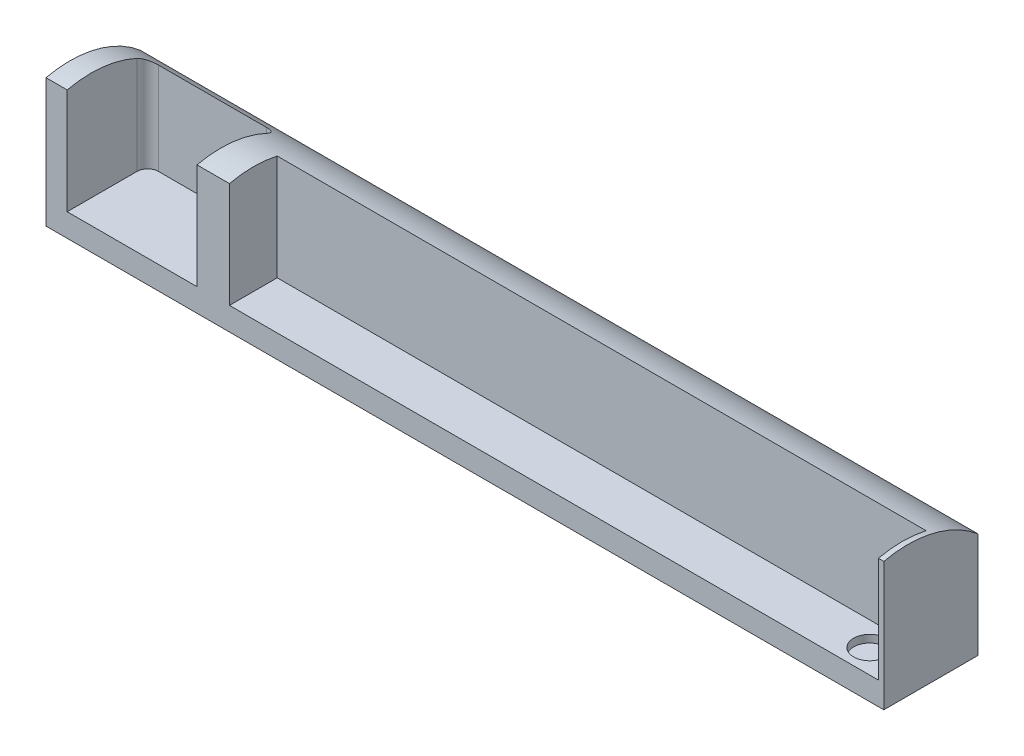
ISO-10303-21;
HEADER;
FILE_DESCRIPTION(('STEP AP214'),'2;1');
FILE_NAME('part.step','',(''),(''),'','','');
FILE_SCHEMA(('AUTOMOTIVE_DESIGN { 1 0 10303 214 1 1 1 1 }'));
ENDSEC;
DATA;
#1=APPLICATION_CONTEXT('core data for automotive mechanical design processes');
#2=APPLICATION_PROTOCOL_DEFINITION('international standard','automotive_design',2000,#1);
#3=PRODUCT_CONTEXT('',#1,'mechanical');
#4=PRODUCT('Part','Part','',(#3));
#5=PRODUCT_RELATED_PRODUCT_CATEGORY('part','',(#4));
#6=PRODUCT_DEFINITION_FORMATION('','',#4);
#7=PRODUCT_DEFINITION_CONTEXT('part definition',#1,'design');
#8=PRODUCT_DEFINITION('design','',#6,#7);
#9=PRODUCT_DEFINITION_SHAPE('','',#8);
#10=(LENGTH_UNIT() NAMED_UNIT(*) SI_UNIT(.MILLI.,.METRE.));
#11=(NAMED_UNIT(*) PLANE_ANGLE_UNIT() SI_UNIT($,.RADIAN.));
#12=(NAMED_UNIT(*) SI_UNIT($,.STERADIAN.) SOLID_ANGLE_UNIT());
#13=UNCERTAINTY_MEASURE_WITH_UNIT(LENGTH_MEASURE(1.E-05),#10,'distance_accuracy_value','');
#14=(GEOMETRIC_REPRESENTATION_CONTEXT(3) GLOBAL_UNCERTAINTY_ASSIGNED_CONTEXT((#13)) GLOBAL_UNIT_ASSIGNED_CONTEXT((#10,
#11,#12)) REPRESENTATION_CONTEXT('',''));
#15=CARTESIAN_POINT('',(0.,0.,0.));
#16=DIRECTION('',(0.,0.,1.));
#17=DIRECTION('',(1.,0.,0.));
#18=AXIS2_PLACEMENT_3D('',#15,#16,#17);
#19=CARTESIAN_POINT('',(125.384435556238,-100.,-65.));
#20=DIRECTION('',(-1.,0.,0.));
#21=DIRECTION('',(0.,0.,1.));
#22=AXIS2_PLACEMENT_3D('',#19,#20,#21);
#23=PLANE('',#22);
#24=DIRECTION('',(0.,1.,0.));
#25=VECTOR('',#24,1.);
#26=CARTESIAN_POINT('',(125.384435556238,-21.3342589780574,22.0794863015094));
#27=LINE('',#26,#25);
#28=CARTESIAN_POINT('',(125.384435556238,-21.3342589780574,22.0794863015094));
#29=VERTEX_POINT('',#28);
#30=CARTESIAN_POINT('',(125.384435556238,97.532026968896,22.0794863015094));
#31=VERTEX_POINT('',#30);
#32=EDGE_CURVE('E50',#29,#31,#27,.T.);
#33=ORIENTED_EDGE('',*,*,#32,.T.);
#34=CARTESIAN_POINT('',(125.384435556238,0.,0.));
#35=DIRECTION('',(-1.,0.,0.));
#36=DIRECTION('',(0.,0.,1.));
#37=AXIS2_PLACEMENT_3D('',#34,#35,#36);
#38=CIRCLE('',#37,100.);
#39=CARTESIAN_POINT('',(125.384435556238,75.9934207678533,-65.));
#40=VERTEX_POINT('',#39);
#41=EDGE_CURVE('E11',#31,#40,#38,.T.);
#42=ORIENTED_EDGE('',*,*,#41,.T.);
#43=DIRECTION('',(0.,1.,0.));
#44=VECTOR('',#43,1.);
#45=CARTESIAN_POINT('',(125.384435556238,-100.,-65.));
#46=LINE('',#45,#44);
#47=CARTESIAN_POINT('',(125.384435556238,-21.3342589780574,-65.));
#48=VERTEX_POINT('',#47);
#49=EDGE_CURVE('E158',#48,#40,#46,.T.);
#50=ORIENTED_EDGE('',*,*,#49,.F.);
#51=DIRECTION('',(0.,0.,1.));
#52=VECTOR('',#51,1.);
#53=CARTESIAN_POINT('',(125.384435556238,-21.3342589780574,-65.));
#54=LINE('',#53,#52);
#55=EDGE_CURVE('E156',#48,#29,#54,.T.);
#56=ORIENTED_EDGE('',*,*,#55,.T.);
#57=EDGE_LOOP('',(#33,#42,#50,#56));
#58=FACE_BOUND('',#57,.T.);
#59=ADVANCED_FACE('F34',(#58),#23,.T.);
#60=CARTESIAN_POINT('',(125.384435556238,-100.,-65.));
#61=DIRECTION('',(0.,0.,-1.));
#62=DIRECTION('',(-1.,0.,0.));
#63=AXIS2_PLACEMENT_3D('',#60,#61,#62);
#64=PLANE('',#63);
#65=DIRECTION('',(0.,1.,0.));
#66=VECTOR('',#65,1.);
#67=CARTESIAN_POINT('',(900.,-100.,-65.));
#68=LINE('',#67,#66);
#69=CARTESIAN_POINT('',(900.,-21.3342589780574,-65.));
#70=VERTEX_POINT('',#69);
#71=CARTESIAN_POINT('',(900.,75.9934207678534,-65.));
#72=VERTEX_POINT('',#71);
#73=EDGE_CURVE('E155',#70,#72,#68,.T.);
#74=ORIENTED_EDGE('',*,*,#73,.F.);
#75=DIRECTION('',(1.,0.,0.));
#76=VECTOR('',#75,1.);
#77=CARTESIAN_POINT('',(125.384435556238,-21.3342589780574,-65.));
#78=LINE('',#77,#76);
#79=EDGE_CURVE('E153',#48,#70,#78,.T.);
#80=ORIENTED_EDGE('',*,*,#79,.F.);
#81=ORIENTED_EDGE('',*,*,#49,.T.);
#82=DIRECTION('',(-1.,0.,0.));
#83=VECTOR('',#82,1.);
#84=CARTESIAN_POINT('',(0.,75.9934207678533,-65.));
#85=LINE('',#84,#83);
#86=EDGE_CURVE('E164',#40,#72,#85,.F.);
#87=ORIENTED_EDGE('',*,*,#86,.T.);
#88=EDGE_LOOP('',(#74,#80,#81,#87));
#89=FACE_BOUND('',#88,.T.);
#90=ADVANCED_FACE('F260',(#89),#64,.T.);
#91=CARTESIAN_POINT('',(900.,-100.,-65.));
#92=DIRECTION('',(1.,0.,0.));
#93=DIRECTION('',(0.,0.,-1.));
#94=AXIS2_PLACEMENT_3D('',#91,#92,#93);
#95=PLANE('',#94);
#96=DIRECTION('',(0.,1.,0.));
#97=VECTOR('',#96,1.);
#98=CARTESIAN_POINT('',(900.,-21.3342589780574,22.0794863015094));
#99=LINE('',#98,#97);
#100=CARTESIAN_POINT('',(900.,-21.3342589780574,22.0794863015094));
#101=VERTEX_POINT('',#100);
#102=CARTESIAN_POINT('',(900.,97.532026968896,22.0794863015094));
#103=VERTEX_POINT('',#102);
#104=EDGE_CURVE('E137',#101,#103,#99,.T.);
#105=ORIENTED_EDGE('',*,*,#104,.F.);
#106=DIRECTION('',(0.,0.,-1.));
#107=VECTOR('',#106,1.);
#108=CARTESIAN_POINT('',(900.,-21.3342589780574,-65.));
#109=LINE('',#108,#107);
#110=EDGE_CURVE('E147',#101,#70,#109,.T.);
#111=ORIENTED_EDGE('',*,*,#110,.T.);
#112=ORIENTED_EDGE('',*,*,#73,.T.);
#113=CARTESIAN_POINT('',(900.,0.,0.));
#114=DIRECTION('',(-1.,0.,0.));
#115=DIRECTION('',(0.,0.,1.));
#116=AXIS2_PLACEMENT_3D('',#113,#114,#115);
#117=CIRCLE('',#116,100.);
#118=EDGE_CURVE('E149',#103,#72,#117,.T.);
#119=ORIENTED_EDGE('',*,*,#118,.F.);
#120=EDGE_LOOP('',(#105,#111,#112,#119));
#121=FACE_BOUND('',#120,.T.);
#122=ADVANCED_FACE('F145',(#121),#95,.T.);
#123=CARTESIAN_POINT('',(0.,0.,0.));
#124=DIRECTION('',(-1.,0.,0.));
#125=DIRECTION('',(0.,0.,1.));
#126=AXIS2_PLACEMENT_3D('',#123,#124,#125);
#127=CYLINDRICAL_SURFACE('',#126,100.);
#128=ORIENTED_EDGE('',*,*,#41,.F.);
#129=DIRECTION('',(-1.,0.,0.));
#130=VECTOR('',#129,1.);
#131=CARTESIAN_POINT('',(0.,97.532026968896,22.0794863015094));
#132=LINE('',#131,#130);
#133=CARTESIAN_POINT('',(144.992275313291,97.532026968896,22.0794863015094));
#134=VERTEX_POINT('',#133);
#135=EDGE_CURVE('E321',#31,#134,#132,.F.);
#136=ORIENTED_EDGE('',*,*,#135,.T.);
#137=CARTESIAN_POINT('',(144.992275313291,0.,0.));
#138=DIRECTION('',(1.,0.,0.));
#139=DIRECTION('',(0.,0.,-1.));
#140=AXIS2_PLACEMENT_3D('',#137,#138,#139);
#141=CIRCLE('',#140,100.);
#142=CARTESIAN_POINT('',(144.992275313291,90.5790034168391,-42.3726815296394));
#143=VERTEX_POINT('',#142);
#144=EDGE_CURVE('E216',#143,#134,#141,.T.);
#145=ORIENTED_EDGE('',*,*,#144,.F.);
#146=CARTESIAN_POINT('',(144.992275313291,90.5790034168391,-42.3726815296394));
#147=CARTESIAN_POINT('',(144.992266455673,90.4327390532218,-42.6853887241199));
#148=CARTESIAN_POINT('',(145.006941937073,90.2848371835829,-42.9972956829604));
#149=CARTESIAN_POINT('',(145.065155574035,89.9869117356524,-43.6173482393163));
#150=CARTESIAN_POINT('',(145.108690953883,89.8368883627625,-43.9254941956582));
#151=CARTESIAN_POINT('',(145.224187646977,89.5356645003747,-44.5362900965118));
#152=CARTESIAN_POINT('',(145.296182917584,89.3844628169994,-44.8389330221261));
#153=CARTESIAN_POINT('',(145.468057545664,89.0822813849903,-45.436319477874));
#154=CARTESIAN_POINT('',(145.567937535926,88.9313016414712,-45.7310628285757));
#155=CARTESIAN_POINT('',(145.795038811292,88.6308562869436,-46.3106672280128));
#156=CARTESIAN_POINT('',(145.922262647325,88.4813908185663,-46.5955273518524));
#157=CARTESIAN_POINT('',(146.20352508244,88.185341391298,-47.1534232038708));
#158=CARTESIAN_POINT('',(146.357573009516,88.0387584545986,-47.426454777325));
#159=CARTESIAN_POINT('',(146.691794819526,87.750098730746,-47.9584375771485));
#160=CARTESIAN_POINT('',(146.871960823601,87.6080206003555,-48.2173930174908));
#161=CARTESIAN_POINT('',(147.257774886447,87.3299879200957,-48.719148982421));
#162=CARTESIAN_POINT('',(147.463423160135,87.194033421886,-48.9619493707319));
#163=CARTESIAN_POINT('',(147.893416699236,86.9336802151978,-49.4227008348896));
#164=CARTESIAN_POINT('',(148.117098414143,86.8090673792119,-49.6411492840996));
#165=CARTESIAN_POINT('',(148.586703051518,86.5692466260571,-50.0581999249176));
#166=CARTESIAN_POINT('',(148.832614451518,86.4540338947236,-50.256812287198));
#167=CARTESIAN_POINT('',(149.345462151893,86.2349095563728,-50.631882867991));
#168=CARTESIAN_POINT('',(149.612395645411,86.1309964450335,-50.8083440359831));
#169=CARTESIAN_POINT('',(150.165579457019,85.9365107152564,-51.1366066955166));
#170=CARTESIAN_POINT('',(150.451825356201,85.8459350600439,-51.288413801297));
#171=CARTESIAN_POINT('',(151.004998860787,85.6903878142627,-51.5478168037729));
#172=CARTESIAN_POINT('',(151.269954383665,85.6236361101927,-51.6585563345459));
#173=CARTESIAN_POINT('',(151.811034830617,85.5032627887518,-51.8575509786716));
#174=CARTESIAN_POINT('',(152.087157225089,85.4496382169235,-51.945811151521));
#175=CARTESIAN_POINT('',(152.647563022696,85.3567898078448,-52.0982379113052));
#176=CARTESIAN_POINT('',(152.931823843795,85.3175296328827,-52.1624653036134));
#177=CARTESIAN_POINT('',(153.50635729278,85.2541628258315,-52.2659682373049));
#178=CARTESIAN_POINT('',(153.796625089994,85.2300444714877,-52.3052630808252));
#179=CARTESIAN_POINT('',(154.238588367731,85.2054064705927,-52.3453812000194));
#180=CARTESIAN_POINT('',(154.389180251192,85.1991146450061,-52.3556201362944));
#181=CARTESIAN_POINT('',(154.690597701414,85.1907265806318,-52.3692671025232));
#182=CARTESIAN_POINT('',(154.841422728266,85.1886250219639,-52.3726837938726));
#183=CARTESIAN_POINT('',(154.992275313291,85.1886273477567,-52.3726815296394));
#184=B_SPLINE_CURVE_WITH_KNOTS('',3,(#146,#147,#148,#149,#150,#151,#152,#153,#154,#155,#156,
#157,#158,#159,#160,#161,#162,#163,#164,#165,#166,#167,#168,#169,#170,#171,#172,#173,#174,#175,
#176,#177,#178,#179,#180,#181,#182,#183),.UNSPECIFIED.,.F.,.F.,(4,2,2,2,2,2,2,2,2,2,2,2,2,2,2,2,
2,2,4),(0.,1.03530983791411,2.07052011533844,3.10696931642731,4.14344203962534,5.18001149818633,
6.2169421430761,7.25356063268882,8.29018786565977,9.29852019717618,10.3063328373354,
11.3140111423901,12.3214596555464,13.2046453057677,14.0876319987211,14.9683692923994,
15.8484239073268,16.3014494641075,16.7538995014114),.UNSPECIFIED.);
#185=CARTESIAN_POINT('',(154.992275313291,85.1886273477567,-52.3726815296394));
#186=VERTEX_POINT('',#185);
#187=EDGE_CURVE('E58',#143,#186,#184,.T.);
#188=ORIENTED_EDGE('',*,*,#187,.T.);
#189=DIRECTION('',(-1.,0.,0.));
#190=VECTOR('',#189,1.);
#191=CARTESIAN_POINT('',(0.,85.1886273477567,-52.3726815296394));
#192=LINE('',#191,#190);
#193=CARTESIAN_POINT('',(254.992275313291,85.1886273477567,-52.3726815296394));
#194=VERTEX_POINT('',#193);
#195=EDGE_CURVE('E212',#194,#186,#192,.T.);
#196=ORIENTED_EDGE('',*,*,#195,.F.);
#197=CARTESIAN_POINT('',(254.992275313291,85.1886273477567,-52.3726815296394));
#198=CARTESIAN_POINT('',(255.118945991111,85.1886263168288,-52.3726824767199));
#199=CARTESIAN_POINT('',(255.245599384915,85.1901074107686,-52.3702741710501));
#200=CARTESIAN_POINT('',(255.498651280743,85.1960201320163,-52.3606550761205));
#201=CARTESIAN_POINT('',(255.625049789664,85.2004516783693,-52.3534444186283));
#202=CARTESIAN_POINT('',(256.003376527491,85.2181437622612,-52.3246454199057));
#203=CARTESIAN_POINT('',(256.25460363012,85.2358017819059,-52.2958900074209));
#204=CARTESIAN_POINT('',(256.751836404865,85.2824027502174,-52.219859635304));
#205=CARTESIAN_POINT('',(256.997861872163,85.3112889650416,-52.1726777752802));
#206=CARTESIAN_POINT('',(257.484276800406,85.3798410827392,-52.0604173677622));
#207=CARTESIAN_POINT('',(257.724665896163,85.4195076820039,-51.9953376640997));
#208=CARTESIAN_POINT('',(258.197824873569,85.5088880193993,-51.8482155445565));
#209=CARTESIAN_POINT('',(258.430606286671,85.5585856457407,-51.766200325615));
#210=CARTESIAN_POINT('',(258.88768124347,85.6673238387794,-51.5860513247685));
#211=CARTESIAN_POINT('',(259.111971515159,85.7263679625823,-51.4879114055563));
#212=CARTESIAN_POINT('',(259.550957452831,85.8529949190893,-51.2764901793884));
#213=CARTESIAN_POINT('',(259.765647097481,85.9205830114844,-51.1631995430994));
#214=CARTESIAN_POINT('',(260.184409281917,86.0634323947222,-50.9225411103541));
#215=CARTESIAN_POINT('',(260.388477684314,86.1386966424362,-50.7951678876556));
#216=CARTESIAN_POINT('',(260.797821443829,86.3010474836128,-50.5188723053816));
#217=CARTESIAN_POINT('',(261.00234140876,86.3885821398158,-50.3690932040207));
#218=CARTESIAN_POINT('',(261.397684631324,86.5703367826651,-50.0560648253454));
#219=CARTESIAN_POINT('',(261.588502894187,86.664559182598,-49.8928106820359));
#220=CARTESIAN_POINT('',(262.139388164444,86.9557670338308,-49.3846787450864));
#221=CARTESIAN_POINT('',(262.478127892948,87.1613908386324,-49.0212662389981));
#222=CARTESIAN_POINT('',(263.137631046763,87.6180639856599,-48.2008810214119));
#223=CARTESIAN_POINT('',(263.4492763587,87.8714467351585,-47.7379300538733));
#224=CARTESIAN_POINT('',(263.98993676309,88.3896930072042,-46.7713849162086));
#225=CARTESIAN_POINT('',(264.21890237762,88.6545632983953,-46.2677666294085));
#226=CARTESIAN_POINT('',(264.501600361948,89.0599011115411,-45.4799612963182));
#227=CARTESIAN_POINT('',(264.586761184652,89.1992613213622,-45.2060630743392));
#228=CARTESIAN_POINT('',(264.73328873568,89.4779621729497,-44.6518792811238));
#229=CARTESIAN_POINT('',(264.794655019082,89.6173028143015,-44.3715935905552));
#230=CARTESIAN_POINT('',(264.89310140332,89.8948770497267,-43.8065061886779));
#231=CARTESIAN_POINT('',(264.930198079072,90.0331113355214,-43.5217076958163));
#232=CARTESIAN_POINT('',(264.979787916748,90.3076941522166,-42.9490612154214));
#233=CARTESIAN_POINT('',(264.992279814023,90.4440425858294,-42.661213071905));
#234=CARTESIAN_POINT('',(264.992275313291,90.5790034168391,-42.3726815296394));
#235=B_SPLINE_CURVE_WITH_KNOTS('',3,(#197,#198,#199,#200,#201,#202,#203,#204,#205,#206,#207,
#208,#209,#210,#211,#212,#213,#214,#215,#216,#217,#218,#219,#220,#221,#222,#223,#224,#225,#226,
#227,#228,#229,#230,#231,#232,#233,#234),.UNSPECIFIED.,.F.,.F.,(4,2,2,2,2,2,2,2,2,2,2,2,2,2,2,2,
2,2,4),(0.,0.379946210549352,0.759881996515674,1.51925238227265,2.2748346785362,
3.03046579551688,3.78489274371263,4.53960750635184,5.29478915693211,6.05026281172443,
6.85398882584001,7.65800635535124,9.26512344844026,11.096696981441,12.9293647716699,
13.8852609326095,14.8411749665076,15.7964354760417,16.7517450832452),.UNSPECIFIED.);
#236=CARTESIAN_POINT('',(264.992275313291,90.5790034168391,-42.3726815296394));
#237=VERTEX_POINT('',#236);
#238=EDGE_CURVE('E43',#194,#237,#235,.T.);
#239=ORIENTED_EDGE('',*,*,#238,.T.);
#240=CARTESIAN_POINT('',(264.992275313291,0.,0.));
#241=DIRECTION('',(-1.,0.,0.));
#242=DIRECTION('',(0.,0.,1.));
#243=AXIS2_PLACEMENT_3D('',#240,#241,#242);
#244=CIRCLE('',#243,100.);
#245=CARTESIAN_POINT('',(264.992275313291,97.532026968896,22.0794863015094));
#246=VERTEX_POINT('',#245);
#247=EDGE_CURVE('E214',#246,#237,#244,.T.);
#248=ORIENTED_EDGE('',*,*,#247,.F.);
#249=CARTESIAN_POINT('',(295.,97.532026968896,22.0794863015094));
#250=VERTEX_POINT('',#249);
#251=EDGE_CURVE('E315',#246,#250,#132,.F.);
#252=ORIENTED_EDGE('',*,*,#251,.T.);
#253=CARTESIAN_POINT('',(295.,0.,0.));
#254=DIRECTION('',(1.,0.,0.));
#255=DIRECTION('',(0.,0.,-1.));
#256=AXIS2_PLACEMENT_3D('',#253,#254,#255);
#257=CIRCLE('',#256,100.);
#258=CARTESIAN_POINT('',(295.,97.532026968896,-22.0794863015094));
#259=VERTEX_POINT('',#258);
#260=EDGE_CURVE('E204',#259,#250,#257,.T.);
#261=ORIENTED_EDGE('',*,*,#260,.F.);
#262=DIRECTION('',(-1.,0.,0.));
#263=VECTOR('',#262,1.);
#264=CARTESIAN_POINT('',(0.,97.532026968896,-22.0794863015094));
#265=LINE('',#264,#263);
#266=CARTESIAN_POINT('',(895.,97.532026968896,-22.0794863015094));
#267=VERTEX_POINT('',#266);
#268=EDGE_CURVE('E209',#267,#259,#265,.T.);
#269=ORIENTED_EDGE('',*,*,#268,.F.);
#270=CARTESIAN_POINT('',(895.,0.,0.));
#271=DIRECTION('',(-1.,0.,0.));
#272=DIRECTION('',(0.,0.,1.));
#273=AXIS2_PLACEMENT_3D('',#270,#271,#272);
#274=CIRCLE('',#273,100.);
#275=CARTESIAN_POINT('',(895.,97.5320269688959,22.0794863015094));
#276=VERTEX_POINT('',#275);
#277=EDGE_CURVE('E207',#276,#267,#274,.T.);
#278=ORIENTED_EDGE('',*,*,#277,.F.);
#279=EDGE_CURVE('E309',#276,#103,#132,.F.);
#280=ORIENTED_EDGE('',*,*,#279,.T.);
#281=ORIENTED_EDGE('',*,*,#118,.T.);
#282=ORIENTED_EDGE('',*,*,#86,.F.);
#283=EDGE_LOOP('',(#128,#136,#145,#188,#196,#239,#248,#252,#261,#269,#278,#280,#281,#282));
#284=FACE_BOUND('',#283,.T.);
#285=ADVANCED_FACE('F242',(#284),#127,.T.);
#286=CARTESIAN_POINT('',(895.,100.,-22.0794863015094));
#287=DIRECTION('',(-1.,0.,0.));
#288=DIRECTION('',(0.,0.,1.));
#289=AXIS2_PLACEMENT_3D('',#286,#287,#288);
#290=PLANE('',#289);
#291=DIRECTION('',(0.,-1.,0.));
#292=VECTOR('',#291,1.);
#293=CARTESIAN_POINT('',(895.,100.,22.0794863015093));
#294=LINE('',#293,#292);
#295=CARTESIAN_POINT('',(895.,0.,22.0794863015094));
#296=VERTEX_POINT('',#295);
#297=EDGE_CURVE('E193',#276,#296,#294,.T.);
#298=ORIENTED_EDGE('',*,*,#297,.F.);
#299=ORIENTED_EDGE('',*,*,#277,.T.);
#300=DIRECTION('',(0.,-1.,0.));
#301=VECTOR('',#300,1.);
#302=CARTESIAN_POINT('',(895.,100.,-22.0794863015094));
#303=LINE('',#302,#301);
#304=CARTESIAN_POINT('',(895.,0.,-22.0794863015094));
#305=VERTEX_POINT('',#304);
#306=EDGE_CURVE('E201',#267,#305,#303,.T.);
#307=ORIENTED_EDGE('',*,*,#306,.T.);
#308=DIRECTION('',(0.,0.,-1.));
#309=VECTOR('',#308,1.);
#310=CARTESIAN_POINT('',(895.,0.,-22.0794863015094));
#311=LINE('',#310,#309);
#312=EDGE_CURVE('E182',#296,#305,#311,.T.);
#313=ORIENTED_EDGE('',*,*,#312,.F.);
#314=EDGE_LOOP('',(#298,#299,#307,#313));
#315=FACE_BOUND('',#314,.T.);
#316=ADVANCED_FACE('F298',(#315),#290,.T.);
#317=CARTESIAN_POINT('',(295.,100.,-22.0794863015094));
#318=DIRECTION('',(0.,0.,1.));
#319=DIRECTION('',(1.,0.,0.));
#320=AXIS2_PLACEMENT_3D('',#317,#318,#319);
#321=PLANE('',#320);
#322=DIRECTION('',(0.,-1.,0.));
#323=VECTOR('',#322,1.);
#324=CARTESIAN_POINT('',(295.,100.,-22.0794863015094));
#325=LINE('',#324,#323);
#326=CARTESIAN_POINT('',(295.,0.,-22.0794863015094));
#327=VERTEX_POINT('',#326);
#328=EDGE_CURVE('E198',#259,#327,#325,.T.);
#329=ORIENTED_EDGE('',*,*,#328,.T.);
#330=DIRECTION('',(-1.,0.,0.));
#331=VECTOR('',#330,1.);
#332=CARTESIAN_POINT('',(295.,0.,-22.0794863015094));
#333=LINE('',#332,#331);
#334=EDGE_CURVE('E185',#305,#327,#333,.T.);
#335=ORIENTED_EDGE('',*,*,#334,.F.);
#336=ORIENTED_EDGE('',*,*,#306,.F.);
#337=ORIENTED_EDGE('',*,*,#268,.T.);
#338=EDGE_LOOP('',(#329,#335,#336,#337));
#339=FACE_BOUND('',#338,.T.);
#340=ADVANCED_FACE('F295',(#339),#321,.T.);
#341=CARTESIAN_POINT('',(295.,100.,-22.0794863015094));
#342=DIRECTION('',(1.,0.,0.));
#343=DIRECTION('',(0.,0.,-1.));
#344=AXIS2_PLACEMENT_3D('',#341,#342,#343);
#345=PLANE('',#344);
#346=ORIENTED_EDGE('',*,*,#328,.F.);
#347=ORIENTED_EDGE('',*,*,#260,.T.);
#348=DIRECTION('',(0.,-1.,0.));
#349=VECTOR('',#348,1.);
#350=CARTESIAN_POINT('',(295.,100.,22.0794863015094));
#351=LINE('',#350,#349);
#352=CARTESIAN_POINT('',(295.,0.,22.0794863015094));
#353=VERTEX_POINT('',#352);
#354=EDGE_CURVE('E195',#250,#353,#351,.T.);
#355=ORIENTED_EDGE('',*,*,#354,.T.);
#356=DIRECTION('',(0.,0.,1.));
#357=VECTOR('',#356,1.);
#358=CARTESIAN_POINT('',(295.,0.,-22.0794863015094));
#359=LINE('',#358,#357);
#360=EDGE_CURVE('E187',#327,#353,#359,.T.);
#361=ORIENTED_EDGE('',*,*,#360,.F.);
#362=EDGE_LOOP('',(#346,#347,#355,#361));
#363=FACE_BOUND('',#362,.T.);
#364=ADVANCED_FACE('F291',(#363),#345,.T.);
#365=CARTESIAN_POINT('',(0.,0.,0.));
#366=DIRECTION('',(0.,1.,0.));
#367=DIRECTION('',(0.,0.,1.));
#368=AXIS2_PLACEMENT_3D('',#365,#366,#367);
#369=PLANE('',#368);
#370=CARTESIAN_POINT('',(865.,0.,0.));
#371=DIRECTION('',(0.,1.,0.));
#372=DIRECTION('',(0.,0.,1.));
#373=AXIS2_PLACEMENT_3D('',#370,#371,#372);
#374=CIRCLE('',#373,15.);
#375=CARTESIAN_POINT('',(865.,0.,15.));
#376=VERTEX_POINT('',#375);
#377=EDGE_CURVE('E168',#376,#376,#374,.T.);
#378=ORIENTED_EDGE('',*,*,#377,.F.);
#379=EDGE_LOOP('',(#378));
#380=FACE_BOUND('',#379,.T.);
#381=ORIENTED_EDGE('',*,*,#334,.T.);
#382=ORIENTED_EDGE('',*,*,#360,.T.);
#383=DIRECTION('',(1.,0.,0.));
#384=VECTOR('',#383,1.);
#385=CARTESIAN_POINT('',(295.,0.,22.0794863015094));
#386=LINE('',#385,#384);
#387=EDGE_CURVE('E190',#353,#296,#386,.T.);
#388=ORIENTED_EDGE('',*,*,#387,.T.);
#389=ORIENTED_EDGE('',*,*,#312,.T.);
#390=EDGE_LOOP('',(#381,#382,#388,#389));
#391=FACE_BOUND('',#390,.T.);
#392=ADVANCED_FACE('F287',(#380,#391),#369,.T.);
#393=CARTESIAN_POINT('',(144.992275313291,161.,52.3726815296393));
#394=DIRECTION('',(1.,0.,0.));
#395=DIRECTION('',(0.,0.,-1.));
#396=AXIS2_PLACEMENT_3D('',#393,#394,#395);
#397=PLANE('',#396);
#398=DIRECTION('',(0.,1.,0.));
#399=VECTOR('',#398,1.);
#400=CARTESIAN_POINT('',(144.992275313291,161.,22.0794863015094));
#401=LINE('',#400,#399);
#402=CARTESIAN_POINT('',(144.992275313291,0.,22.0794863015094));
#403=VERTEX_POINT('',#402);
#404=EDGE_CURVE('E322',#403,#134,#401,.T.);
#405=ORIENTED_EDGE('',*,*,#404,.F.);
#406=DIRECTION('',(0.,0.,1.));
#407=VECTOR('',#406,1.);
#408=CARTESIAN_POINT('',(144.992275313291,0.,52.3726815296393));
#409=LINE('',#408,#407);
#410=CARTESIAN_POINT('',(144.992275313291,0.,-42.3726815296394));
#411=VERTEX_POINT('',#410);
#412=EDGE_CURVE('E172',#411,#403,#409,.T.);
#413=ORIENTED_EDGE('',*,*,#412,.F.);
#414=DIRECTION('',(0.,-1.,0.));
#415=VECTOR('',#414,1.);
#416=CARTESIAN_POINT('',(144.992275313291,85.1886273477567,-42.3726815296394));
#417=LINE('',#416,#415);
#418=EDGE_CURVE('E226',#411,#143,#417,.F.);
#419=ORIENTED_EDGE('',*,*,#418,.T.);
#420=ORIENTED_EDGE('',*,*,#144,.T.);
#421=EDGE_LOOP('',(#405,#413,#419,#420));
#422=FACE_BOUND('',#421,.T.);
#423=ADVANCED_FACE('F283',(#422),#397,.T.);
#424=CARTESIAN_POINT('',(264.992275313291,161.,52.3726815296393));
#425=DIRECTION('',(-1.,0.,0.));
#426=DIRECTION('',(0.,0.,1.));
#427=AXIS2_PLACEMENT_3D('',#424,#425,#426);
#428=PLANE('',#427);
#429=DIRECTION('',(0.,-1.,0.));
#430=VECTOR('',#429,1.);
#431=CARTESIAN_POINT('',(264.992275313291,161.,22.0794863015094));
#432=LINE('',#431,#430);
#433=CARTESIAN_POINT('',(264.992275313291,0.,22.0794863015094));
#434=VERTEX_POINT('',#433);
#435=EDGE_CURVE('E325',#246,#434,#432,.T.);
#436=ORIENTED_EDGE('',*,*,#435,.F.);
#437=ORIENTED_EDGE('',*,*,#247,.T.);
#438=DIRECTION('',(0.,-1.,0.));
#439=VECTOR('',#438,1.);
#440=CARTESIAN_POINT('',(264.992275313291,0.,-42.3726815296394));
#441=LINE('',#440,#439);
#442=CARTESIAN_POINT('',(264.992275313291,0.,-42.3726815296394));
#443=VERTEX_POINT('',#442);
#444=EDGE_CURVE('E223',#237,#443,#441,.T.);
#445=ORIENTED_EDGE('',*,*,#444,.T.);
#446=DIRECTION('',(0.,0.,-1.));
#447=VECTOR('',#446,1.);
#448=CARTESIAN_POINT('',(264.992275313291,0.,52.3726815296393));
#449=LINE('',#448,#447);
#450=EDGE_CURVE('E177',#434,#443,#449,.T.);
#451=ORIENTED_EDGE('',*,*,#450,.F.);
#452=EDGE_LOOP('',(#436,#437,#445,#451));
#453=FACE_BOUND('',#452,.T.);
#454=ADVANCED_FACE('F279',(#453),#428,.T.);
#455=CARTESIAN_POINT('',(264.992275313291,161.,-52.3726815296394));
#456=DIRECTION('',(0.,0.,1.));
#457=DIRECTION('',(1.,0.,0.));
#458=AXIS2_PLACEMENT_3D('',#455,#456,#457);
#459=PLANE('',#458);
#460=ORIENTED_EDGE('',*,*,#195,.T.);
#461=DIRECTION('',(0.,-1.,0.));
#462=VECTOR('',#461,1.);
#463=CARTESIAN_POINT('',(154.992275313291,0.,-52.3726815296394));
#464=LINE('',#463,#462);
#465=CARTESIAN_POINT('',(154.992275313291,0.,-52.3726815296394));
#466=VERTEX_POINT('',#465);
#467=EDGE_CURVE('E230',#186,#466,#464,.T.);
#468=ORIENTED_EDGE('',*,*,#467,.T.);
#469=DIRECTION('',(-1.,0.,0.));
#470=VECTOR('',#469,1.);
#471=CARTESIAN_POINT('',(264.992275313291,0.,-52.3726815296394));
#472=LINE('',#471,#470);
#473=CARTESIAN_POINT('',(254.992275313291,0.,-52.3726815296394));
#474=VERTEX_POINT('',#473);
#475=EDGE_CURVE('E179',#474,#466,#472,.T.);
#476=ORIENTED_EDGE('',*,*,#475,.F.);
#477=DIRECTION('',(0.,-1.,0.));
#478=VECTOR('',#477,1.);
#479=CARTESIAN_POINT('',(254.992275313291,85.1886273477567,-52.3726815296394));
#480=LINE('',#479,#478);
#481=EDGE_CURVE('E228',#474,#194,#480,.F.);
#482=ORIENTED_EDGE('',*,*,#481,.T.);
#483=EDGE_LOOP('',(#460,#468,#476,#482));
#484=FACE_BOUND('',#483,.T.);
#485=ADVANCED_FACE('F256',(#484),#459,.T.);
#486=CARTESIAN_POINT('',(0.,0.,0.));
#487=DIRECTION('',(0.,1.,0.));
#488=DIRECTION('',(0.,0.,1.));
#489=AXIS2_PLACEMENT_3D('',#486,#487,#488);
#490=PLANE('',#489);
#491=DIRECTION('',(-1.,0.,0.));
#492=VECTOR('',#491,1.);
#493=CARTESIAN_POINT('',(0.,0.,22.0794863015094));
#494=LINE('',#493,#492);
#495=EDGE_CURVE('E340',#434,#403,#494,.T.);
#496=ORIENTED_EDGE('',*,*,#495,.F.);
#497=ORIENTED_EDGE('',*,*,#450,.T.);
#498=CARTESIAN_POINT('',(254.992275313291,0.,-42.3726815296394));
#499=DIRECTION('',(0.,1.,0.));
#500=DIRECTION('',(0.,0.,1.));
#501=AXIS2_PLACEMENT_3D('',#498,#499,#500);
#502=CIRCLE('',#501,10.);
#503=EDGE_CURVE('E219',#443,#474,#502,.T.);
#504=ORIENTED_EDGE('',*,*,#503,.T.);
#505=ORIENTED_EDGE('',*,*,#475,.T.);
#506=CARTESIAN_POINT('',(154.992275313291,0.,-42.3726815296394));
#507=DIRECTION('',(0.,1.,0.));
#508=DIRECTION('',(0.,0.,1.));
#509=AXIS2_PLACEMENT_3D('',#506,#507,#508);
#510=CIRCLE('',#509,10.);
#511=EDGE_CURVE('E221',#466,#411,#510,.T.);
#512=ORIENTED_EDGE('',*,*,#511,.T.);
#513=ORIENTED_EDGE('',*,*,#412,.T.);
#514=EDGE_LOOP('',(#496,#497,#504,#505,#512,#513));
#515=FACE_BOUND('',#514,.T.);
#516=ADVANCED_FACE('F248',(#515),#490,.T.);
#517=CARTESIAN_POINT('',(154.992275313291,161.,-42.3726815296394));
#518=DIRECTION('',(0.,1.,0.));
#519=DIRECTION('',(0.,0.,1.));
#520=AXIS2_PLACEMENT_3D('',#517,#518,#519);
#521=CYLINDRICAL_SURFACE('',#520,10.);
#522=ORIENTED_EDGE('',*,*,#187,.F.);
#523=ORIENTED_EDGE('',*,*,#418,.F.);
#524=ORIENTED_EDGE('',*,*,#511,.F.);
#525=ORIENTED_EDGE('',*,*,#467,.F.);
#526=EDGE_LOOP('',(#522,#523,#524,#525));
#527=FACE_BOUND('',#526,.T.);
#528=ADVANCED_FACE('F245',(#527),#521,.F.);
#529=CARTESIAN_POINT('',(254.992275313291,161.,-42.3726815296394));
#530=DIRECTION('',(0.,1.,0.));
#531=DIRECTION('',(0.,0.,1.));
#532=AXIS2_PLACEMENT_3D('',#529,#530,#531);
#533=CYLINDRICAL_SURFACE('',#532,10.);
#534=ORIENTED_EDGE('',*,*,#238,.F.);
#535=ORIENTED_EDGE('',*,*,#481,.F.);
#536=ORIENTED_EDGE('',*,*,#503,.F.);
#537=ORIENTED_EDGE('',*,*,#444,.F.);
#538=EDGE_LOOP('',(#534,#535,#536,#537));
#539=FACE_BOUND('',#538,.T.);
#540=ADVANCED_FACE('F36',(#539),#533,.F.);
#541=CARTESIAN_POINT('',(865.,-7.,0.));
#542=DIRECTION('',(0.,1.,0.));
#543=DIRECTION('',(0.,0.,1.));
#544=AXIS2_PLACEMENT_3D('',#541,#542,#543);
#545=CYLINDRICAL_SURFACE('',#544,15.);
#546=CARTESIAN_POINT('',(865.,-7.,0.));
#547=DIRECTION('',(0.,1.,0.));
#548=DIRECTION('',(0.,0.,1.));
#549=AXIS2_PLACEMENT_3D('',#546,#547,#548);
#550=CIRCLE('',#549,15.);
#551=CARTESIAN_POINT('',(865.,-7.,15.));
#552=VERTEX_POINT('',#551);
#553=EDGE_CURVE('E169',#552,#552,#550,.T.);
#554=ORIENTED_EDGE('',*,*,#553,.F.);
#555=EDGE_LOOP('',(#554));
#556=FACE_BOUND('',#555,.T.);
#557=ORIENTED_EDGE('',*,*,#377,.T.);
#558=EDGE_LOOP('',(#557));
#559=FACE_BOUND('',#558,.T.);
#560=ADVANCED_FACE('F254',(#556,#559),#545,.F.);
#561=CARTESIAN_POINT('',(865.,-7.,0.));
#562=DIRECTION('',(0.,1.,0.));
#563=DIRECTION('',(0.,0.,1.));
#564=AXIS2_PLACEMENT_3D('',#561,#562,#563);
#565=PLANE('',#564);
#566=ORIENTED_EDGE('',*,*,#553,.T.);
#567=EDGE_LOOP('',(#566));
#568=FACE_BOUND('',#567,.T.);
#569=ADVANCED_FACE('F270',(#568),#565,.T.);
#570=CARTESIAN_POINT('',(125.384435556238,-21.3342589780574,-65.));
#571=DIRECTION('',(0.,-1.,0.));
#572=DIRECTION('',(0.,0.,-1.));
#573=AXIS2_PLACEMENT_3D('',#570,#571,#572);
#574=PLANE('',#573);
#575=DIRECTION('',(-1.,0.,0.));
#576=VECTOR('',#575,1.);
#577=CARTESIAN_POINT('',(125.384435556238,-21.3342589780574,22.0794863015094));
#578=LINE('',#577,#576);
#579=EDGE_CURVE('E134',#101,#29,#578,.T.);
#580=ORIENTED_EDGE('',*,*,#579,.T.);
#581=ORIENTED_EDGE('',*,*,#55,.F.);
#582=ORIENTED_EDGE('',*,*,#79,.T.);
#583=ORIENTED_EDGE('',*,*,#110,.F.);
#584=EDGE_LOOP('',(#580,#581,#582,#583));
#585=FACE_BOUND('',#584,.T.);
#586=ADVANCED_FACE('F151',(#585),#574,.T.);
#587=CARTESIAN_POINT('',(125.384435556238,-21.3342589780574,22.0794863015094));
#588=DIRECTION('',(0.,0.,-1.));
#589=DIRECTION('',(-1.,0.,0.));
#590=AXIS2_PLACEMENT_3D('',#587,#588,#589);
#591=PLANE('',#590);
#592=ORIENTED_EDGE('',*,*,#297,.T.);
#593=ORIENTED_EDGE('',*,*,#387,.F.);
#594=ORIENTED_EDGE('',*,*,#354,.F.);
#595=ORIENTED_EDGE('',*,*,#251,.F.);
#596=ORIENTED_EDGE('',*,*,#435,.T.);
#597=ORIENTED_EDGE('',*,*,#495,.T.);
#598=ORIENTED_EDGE('',*,*,#404,.T.);
#599=ORIENTED_EDGE('',*,*,#135,.F.);
#600=ORIENTED_EDGE('',*,*,#32,.F.);
#601=ORIENTED_EDGE('',*,*,#579,.F.);
#602=ORIENTED_EDGE('',*,*,#104,.T.);
#603=ORIENTED_EDGE('',*,*,#279,.F.);
#604=EDGE_LOOP('',(#592,#593,#594,#595,#596,#597,#598,#599,#600,#601,#602,#603));
#605=FACE_BOUND('',#604,.T.);
#606=ADVANCED_FACE('F136',(#605),#591,.F.);
#607=CLOSED_SHELL('',(#59,#90,#122,#285,#316,#340,#364,#392,#423,#454,#485,#516,#528,#540,#560,
#569,#586,#606));
#608=MANIFOLD_SOLID_BREP('B2',#607);
#609=ADVANCED_BREP_SHAPE_REPRESENTATION('',(#18,#608),#14);
#610=SHAPE_DEFINITION_REPRESENTATION(#9,#609);
ENDSEC;
END-ISO-10303-21;
